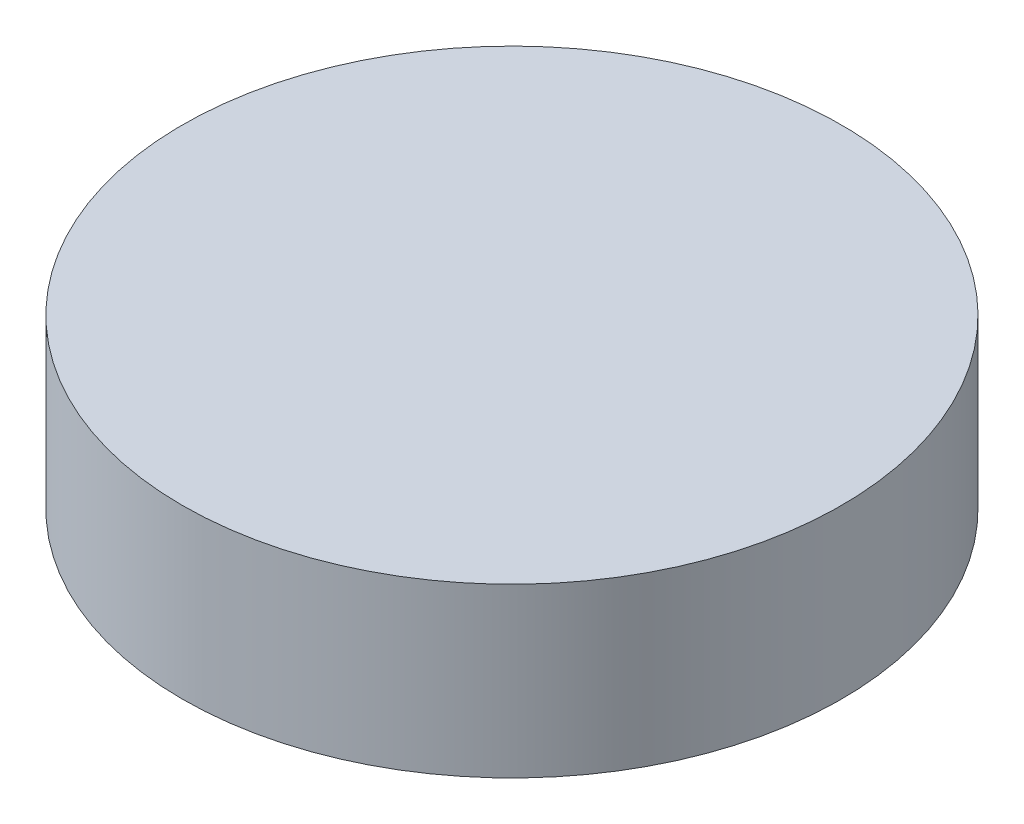
ISO-10303-21;
HEADER;
FILE_DESCRIPTION(('STEP AP214'),'2;1');
FILE_NAME('part.step','',(''),(''),'','','');
FILE_SCHEMA(('AUTOMOTIVE_DESIGN { 1 0 10303 214 1 1 1 1 }'));
ENDSEC;
DATA;
#1=APPLICATION_CONTEXT('core data for automotive mechanical design processes');
#2=APPLICATION_PROTOCOL_DEFINITION('international standard','automotive_design',2000,#1);
#3=PRODUCT_CONTEXT('',#1,'mechanical');
#4=PRODUCT('Part','Part','',(#3));
#5=PRODUCT_RELATED_PRODUCT_CATEGORY('part','',(#4));
#6=PRODUCT_DEFINITION_FORMATION('','',#4);
#7=PRODUCT_DEFINITION_CONTEXT('part definition',#1,'design');
#8=PRODUCT_DEFINITION('design','',#6,#7);
#9=PRODUCT_DEFINITION_SHAPE('','',#8);
#10=(LENGTH_UNIT() NAMED_UNIT(*) SI_UNIT(.MILLI.,.METRE.));
#11=(NAMED_UNIT(*) PLANE_ANGLE_UNIT() SI_UNIT($,.RADIAN.));
#12=(NAMED_UNIT(*) SI_UNIT($,.STERADIAN.) SOLID_ANGLE_UNIT());
#13=UNCERTAINTY_MEASURE_WITH_UNIT(LENGTH_MEASURE(1.E-05),#10,'distance_accuracy_value','');
#14=(GEOMETRIC_REPRESENTATION_CONTEXT(3) GLOBAL_UNCERTAINTY_ASSIGNED_CONTEXT((#13)) GLOBAL_UNIT_ASSIGNED_CONTEXT((#10,
#11,#12)) REPRESENTATION_CONTEXT('',''));
#15=CARTESIAN_POINT('',(0.,0.,0.));
#16=DIRECTION('',(0.,0.,1.));
#17=DIRECTION('',(1.,0.,0.));
#18=AXIS2_PLACEMENT_3D('',#15,#16,#17);
#19=CARTESIAN_POINT('',(0.,35.56,0.));
#20=DIRECTION('',(0.,-1.,0.));
#21=DIRECTION('',(0.,0.,-1.));
#22=AXIS2_PLACEMENT_3D('',#19,#20,#21);
#23=CYLINDRICAL_SURFACE('',#22,69.85);
#24=CARTESIAN_POINT('',(0.,35.56,0.));
#25=DIRECTION('',(0.,1.,0.));
#26=DIRECTION('',(0.,0.,1.));
#27=AXIS2_PLACEMENT_3D('',#24,#25,#26);
#28=CIRCLE('',#27,69.85);
#29=CARTESIAN_POINT('',(0.,35.56,69.85));
#30=VERTEX_POINT('',#29);
#31=EDGE_CURVE('E10',#30,#30,#28,.T.);
#32=ORIENTED_EDGE('',*,*,#31,.F.);
#33=EDGE_LOOP('',(#32));
#34=FACE_BOUND('',#33,.T.);
#35=CARTESIAN_POINT('',(0.,0.,0.));
#36=DIRECTION('',(0.,1.,0.));
#37=DIRECTION('',(0.,0.,1.));
#38=AXIS2_PLACEMENT_3D('',#35,#36,#37);
#39=CIRCLE('',#38,69.85);
#40=CARTESIAN_POINT('',(0.,0.,69.85));
#41=VERTEX_POINT('',#40);
#42=EDGE_CURVE('E34',#41,#41,#39,.T.);
#43=ORIENTED_EDGE('',*,*,#42,.T.);
#44=EDGE_LOOP('',(#43));
#45=FACE_BOUND('',#44,.T.);
#46=ADVANCED_FACE('F31',(#34,#45),#23,.T.);
#47=CARTESIAN_POINT('',(0.,35.56,0.));
#48=DIRECTION('',(0.,1.,0.));
#49=DIRECTION('',(0.,0.,1.));
#50=AXIS2_PLACEMENT_3D('',#47,#48,#49);
#51=PLANE('',#50);
#52=ORIENTED_EDGE('',*,*,#31,.T.);
#53=EDGE_LOOP('',(#52));
#54=FACE_BOUND('',#53,.T.);
#55=ADVANCED_FACE('F46',(#54),#51,.T.);
#56=CARTESIAN_POINT('',(0.,0.,0.));
#57=DIRECTION('',(0.,1.,0.));
#58=DIRECTION('',(0.,0.,1.));
#59=AXIS2_PLACEMENT_3D('',#56,#57,#58);
#60=PLANE('',#59);
#61=ORIENTED_EDGE('',*,*,#42,.F.);
#62=EDGE_LOOP('',(#61));
#63=FACE_BOUND('',#62,.T.);
#64=ADVANCED_FACE('F44',(#63),#60,.F.);
#65=CLOSED_SHELL('',(#46,#55,#64));
#66=MANIFOLD_SOLID_BREP('B2',#65);
#67=ADVANCED_BREP_SHAPE_REPRESENTATION('',(#18,#66),#14);
#68=SHAPE_DEFINITION_REPRESENTATION(#9,#67);
ENDSEC;
END-ISO-10303-21;
